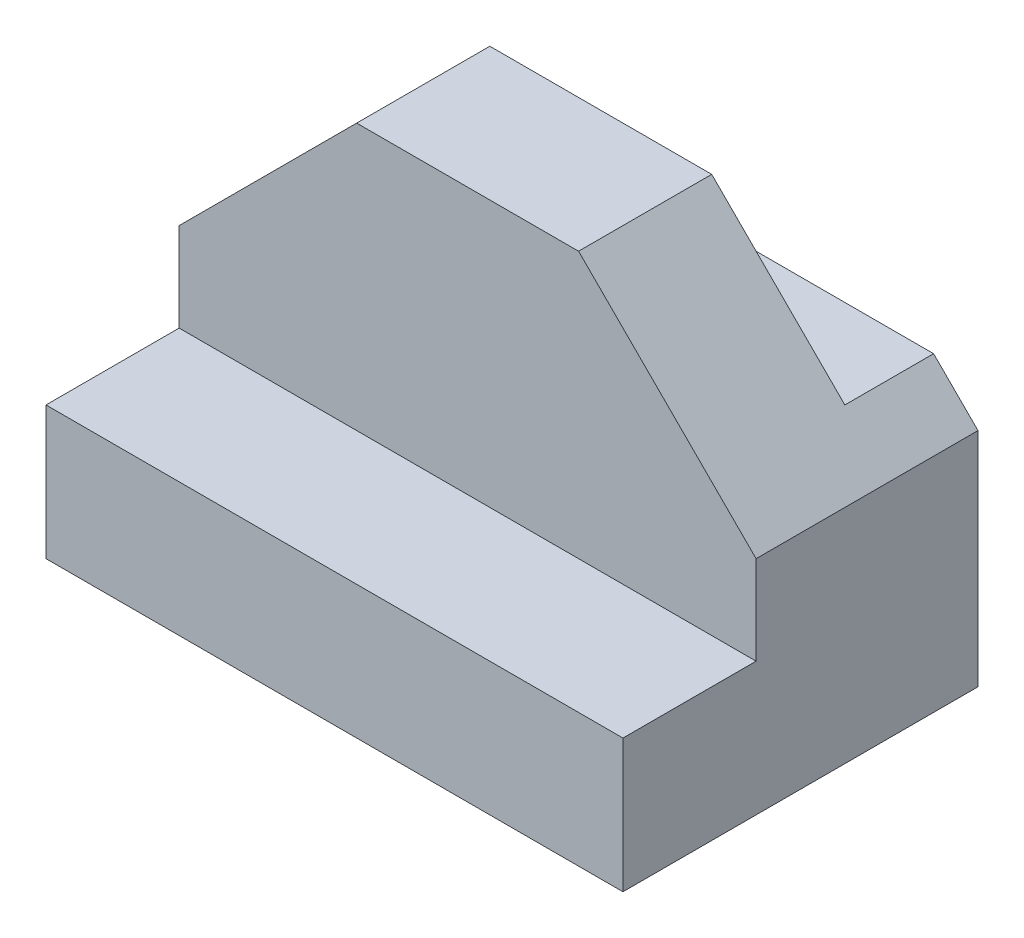
ISO-10303-21;
HEADER;
FILE_DESCRIPTION(('STEP AP214'),'2;1');
FILE_NAME('part.step','',(''),(''),'','','');
FILE_SCHEMA(('AUTOMOTIVE_DESIGN { 1 0 10303 214 1 1 1 1 }'));
ENDSEC;
DATA;
#1=APPLICATION_CONTEXT('core data for automotive mechanical design processes');
#2=APPLICATION_PROTOCOL_DEFINITION('international standard','automotive_design',2000,#1);
#3=PRODUCT_CONTEXT('',#1,'mechanical');
#4=PRODUCT('Part','Part','',(#3));
#5=PRODUCT_RELATED_PRODUCT_CATEGORY('part','',(#4));
#6=PRODUCT_DEFINITION_FORMATION('','',#4);
#7=PRODUCT_DEFINITION_CONTEXT('part definition',#1,'design');
#8=PRODUCT_DEFINITION('design','',#6,#7);
#9=PRODUCT_DEFINITION_SHAPE('','',#8);
#10=(LENGTH_UNIT() NAMED_UNIT(*) SI_UNIT(.MILLI.,.METRE.));
#11=(NAMED_UNIT(*) PLANE_ANGLE_UNIT() SI_UNIT($,.RADIAN.));
#12=(NAMED_UNIT(*) SI_UNIT($,.STERADIAN.) SOLID_ANGLE_UNIT());
#13=UNCERTAINTY_MEASURE_WITH_UNIT(LENGTH_MEASURE(1.E-05),#10,'distance_accuracy_value','');
#14=(GEOMETRIC_REPRESENTATION_CONTEXT(3) GLOBAL_UNCERTAINTY_ASSIGNED_CONTEXT((#13)) GLOBAL_UNIT_ASSIGNED_CONTEXT((#10,
#11,#12)) REPRESENTATION_CONTEXT('',''));
#15=CARTESIAN_POINT('',(0.,0.,0.));
#16=DIRECTION('',(0.,0.,1.));
#17=DIRECTION('',(1.,0.,0.));
#18=AXIS2_PLACEMENT_3D('',#15,#16,#17);
#19=CARTESIAN_POINT('',(65.,2.36648320366556,20.6941876196283));
#20=DIRECTION('',(0.,0.,-1.));
#21=DIRECTION('',(0.,1.,0.));
#22=AXIS2_PLACEMENT_3D('',#19,#20,#21);
#23=PLANE('',#22);
#24=DIRECTION('',(0.,-1.,0.));
#25=VECTOR('',#24,1.);
#26=CARTESIAN_POINT('',(0.,2.36648320366556,20.6941876196283));
#27=LINE('',#26,#25);
#28=CARTESIAN_POINT('',(0.,2.36648320366556,20.6941876196283));
#29=VERTEX_POINT('',#28);
#30=CARTESIAN_POINT('',(0.,-12.6335167963344,20.6941876196283));
#31=VERTEX_POINT('',#30);
#32=EDGE_CURVE('E138',#29,#31,#27,.T.);
#33=ORIENTED_EDGE('',*,*,#32,.T.);
#34=DIRECTION('',(-1.,0.,0.));
#35=VECTOR('',#34,1.);
#36=CARTESIAN_POINT('',(65.,-12.6335167963344,20.6941876196283));
#37=LINE('',#36,#35);
#38=CARTESIAN_POINT('',(65.,-12.6335167963344,20.6941876196283));
#39=VERTEX_POINT('',#38);
#40=EDGE_CURVE('E118',#39,#31,#37,.T.);
#41=ORIENTED_EDGE('',*,*,#40,.F.);
#42=DIRECTION('',(0.,-1.,0.));
#43=VECTOR('',#42,1.);
#44=CARTESIAN_POINT('',(65.,2.36648320366556,20.6941876196283));
#45=LINE('',#44,#43);
#46=CARTESIAN_POINT('',(65.,2.36648320366556,20.6941876196283));
#47=VERTEX_POINT('',#46);
#48=EDGE_CURVE('E126',#47,#39,#45,.T.);
#49=ORIENTED_EDGE('',*,*,#48,.F.);
#50=DIRECTION('',(-1.,0.,0.));
#51=VECTOR('',#50,1.);
#52=CARTESIAN_POINT('',(65.,2.36648320366556,20.6941876196283));
#53=LINE('',#52,#51);
#54=EDGE_CURVE('E209',#47,#29,#53,.T.);
#55=ORIENTED_EDGE('',*,*,#54,.T.);
#56=EDGE_LOOP('',(#33,#41,#49,#55));
#57=FACE_BOUND('',#56,.T.);
#58=ADVANCED_FACE('F35',(#57),#23,.F.);
#59=CARTESIAN_POINT('',(65.,-12.6335167963344,20.6941876196283));
#60=DIRECTION('',(0.,1.,0.));
#61=DIRECTION('',(0.,0.,1.));
#62=AXIS2_PLACEMENT_3D('',#59,#60,#61);
#63=PLANE('',#62);
#64=DIRECTION('',(0.,0.,-1.));
#65=VECTOR('',#64,1.);
#66=CARTESIAN_POINT('',(0.,-12.6335167963344,20.6941876196283));
#67=LINE('',#66,#65);
#68=CARTESIAN_POINT('',(0.,-12.6335167963344,-19.3058123803717));
#69=VERTEX_POINT('',#68);
#70=EDGE_CURVE('E174',#31,#69,#67,.T.);
#71=ORIENTED_EDGE('',*,*,#70,.T.);
#72=DIRECTION('',(-1.,0.,0.));
#73=VECTOR('',#72,1.);
#74=CARTESIAN_POINT('',(65.,-12.6335167963344,-19.3058123803717));
#75=LINE('',#74,#73);
#76=CARTESIAN_POINT('',(65.,-12.6335167963344,-19.3058123803717));
#77=VERTEX_POINT('',#76);
#78=EDGE_CURVE('E121',#77,#69,#75,.T.);
#79=ORIENTED_EDGE('',*,*,#78,.F.);
#80=DIRECTION('',(0.,0.,-1.));
#81=VECTOR('',#80,1.);
#82=CARTESIAN_POINT('',(65.,-12.6335167963344,20.6941876196283));
#83=LINE('',#82,#81);
#84=EDGE_CURVE('E114',#39,#77,#83,.T.);
#85=ORIENTED_EDGE('',*,*,#84,.F.);
#86=ORIENTED_EDGE('',*,*,#40,.T.);
#87=EDGE_LOOP('',(#71,#79,#85,#86));
#88=FACE_BOUND('',#87,.T.);
#89=ADVANCED_FACE('F116',(#88),#63,.F.);
#90=CARTESIAN_POINT('',(65.,-12.6335167963344,-19.3058123803717));
#91=DIRECTION('',(0.,0.,1.));
#92=DIRECTION('',(0.,-1.,0.));
#93=AXIS2_PLACEMENT_3D('',#90,#91,#92);
#94=PLANE('',#93);
#95=DIRECTION('',(0.,1.,0.));
#96=VECTOR('',#95,1.);
#97=CARTESIAN_POINT('',(0.,-12.6335167963344,-19.3058123803717));
#98=LINE('',#97,#96);
#99=CARTESIAN_POINT('',(0.,12.3664832036655,-19.3058123803717));
#100=VERTEX_POINT('',#99);
#101=EDGE_CURVE('E169',#69,#100,#98,.T.);
#102=ORIENTED_EDGE('',*,*,#101,.T.);
#103=DIRECTION('',(-0.707106781186546,-0.707106781186549,0.));
#104=VECTOR('',#103,1.);
#105=CARTESIAN_POINT('',(20.,32.3664832036656,-19.3058123803717));
#106=LINE('',#105,#104);
#107=CARTESIAN_POINT('',(5.00000000000005,17.3664832036656,-19.3058123803717));
#108=VERTEX_POINT('',#107);
#109=EDGE_CURVE('E58',#100,#108,#106,.F.);
#110=ORIENTED_EDGE('',*,*,#109,.T.);
#111=DIRECTION('',(-1.,0.,0.));
#112=VECTOR('',#111,1.);
#113=CARTESIAN_POINT('',(65.,17.3664832036656,-19.3058123803717));
#114=LINE('',#113,#112);
#115=CARTESIAN_POINT('',(60.,17.3664832036656,-19.3058123803717));
#116=VERTEX_POINT('',#115);
#117=EDGE_CURVE('E144',#116,#108,#114,.T.);
#118=ORIENTED_EDGE('',*,*,#117,.F.);
#119=DIRECTION('',(0.707106781186549,-0.707106781186546,0.));
#120=VECTOR('',#119,1.);
#121=CARTESIAN_POINT('',(65.,12.3664832036656,-19.3058123803717));
#122=LINE('',#121,#120);
#123=CARTESIAN_POINT('',(65.,12.3664832036656,-19.3058123803717));
#124=VERTEX_POINT('',#123);
#125=EDGE_CURVE('E155',#116,#124,#122,.T.);
#126=ORIENTED_EDGE('',*,*,#125,.T.);
#127=DIRECTION('',(0.,1.,0.));
#128=VECTOR('',#127,1.);
#129=CARTESIAN_POINT('',(65.,-12.6335167963344,-19.3058123803717));
#130=LINE('',#129,#128);
#131=EDGE_CURVE('E125',#77,#124,#130,.T.);
#132=ORIENTED_EDGE('',*,*,#131,.F.);
#133=ORIENTED_EDGE('',*,*,#78,.T.);
#134=EDGE_LOOP('',(#102,#110,#118,#126,#132,#133));
#135=FACE_BOUND('',#134,.T.);
#136=ADVANCED_FACE('F173',(#135),#94,.F.);
#137=CARTESIAN_POINT('',(65.,17.3664832036656,-19.3058123803717));
#138=DIRECTION('',(0.,-1.,0.));
#139=DIRECTION('',(0.,0.,-1.));
#140=AXIS2_PLACEMENT_3D('',#137,#138,#139);
#141=PLANE('',#140);
#142=ORIENTED_EDGE('',*,*,#117,.T.);
#143=DIRECTION('',(0.,0.,-1.));
#144=VECTOR('',#143,1.);
#145=CARTESIAN_POINT('',(5.00000000000005,17.3664832036656,-9.30581238037173));
#146=LINE('',#145,#144);
#147=CARTESIAN_POINT('',(5.00000000000005,17.3664832036656,-9.30581238037173));
#148=VERTEX_POINT('',#147);
#149=EDGE_CURVE('E44',#108,#148,#146,.F.);
#150=ORIENTED_EDGE('',*,*,#149,.T.);
#151=DIRECTION('',(-1.,0.,0.));
#152=VECTOR('',#151,1.);
#153=CARTESIAN_POINT('',(65.,17.3664832036656,-9.30581238037173));
#154=LINE('',#153,#152);
#155=CARTESIAN_POINT('',(60.,17.3664832036656,-9.30581238037173));
#156=VERTEX_POINT('',#155);
#157=EDGE_CURVE('E184',#156,#148,#154,.T.);
#158=ORIENTED_EDGE('',*,*,#157,.F.);
#159=DIRECTION('',(0.,0.,-1.));
#160=VECTOR('',#159,1.);
#161=CARTESIAN_POINT('',(60.,17.3664832036656,0.));
#162=LINE('',#161,#160);
#163=EDGE_CURVE('E153',#156,#116,#162,.T.);
#164=ORIENTED_EDGE('',*,*,#163,.T.);
#165=EDGE_LOOP('',(#142,#150,#158,#164));
#166=FACE_BOUND('',#165,.T.);
#167=ADVANCED_FACE('F196',(#166),#141,.F.);
#168=CARTESIAN_POINT('',(65.,17.3664832036656,-9.30581238037173));
#169=DIRECTION('',(0.,0.,1.));
#170=DIRECTION('',(0.,-1.,0.));
#171=AXIS2_PLACEMENT_3D('',#168,#169,#170);
#172=PLANE('',#171);
#173=ORIENTED_EDGE('',*,*,#157,.T.);
#174=DIRECTION('',(-0.707106781186546,-0.707106781186549,0.));
#175=VECTOR('',#174,1.);
#176=CARTESIAN_POINT('',(20.,32.3664832036656,-9.30581238037172));
#177=LINE('',#176,#175);
#178=CARTESIAN_POINT('',(20.,32.3664832036656,-9.30581238037172));
#179=VERTEX_POINT('',#178);
#180=EDGE_CURVE('E11',#148,#179,#177,.F.);
#181=ORIENTED_EDGE('',*,*,#180,.T.);
#182=DIRECTION('',(-1.,0.,0.));
#183=VECTOR('',#182,1.);
#184=CARTESIAN_POINT('',(65.,32.3664832036656,-9.30581238037172));
#185=LINE('',#184,#183);
#186=CARTESIAN_POINT('',(44.9999999999999,32.3664832036656,-9.30581238037172));
#187=VERTEX_POINT('',#186);
#188=EDGE_CURVE('E182',#187,#179,#185,.T.);
#189=ORIENTED_EDGE('',*,*,#188,.F.);
#190=DIRECTION('',(0.707106781186549,-0.707106781186546,0.));
#191=VECTOR('',#190,1.);
#192=CARTESIAN_POINT('',(65.,12.3664832036656,-9.30581238037173));
#193=LINE('',#192,#191);
#194=EDGE_CURVE('E151',#187,#156,#193,.T.);
#195=ORIENTED_EDGE('',*,*,#194,.T.);
#196=EDGE_LOOP('',(#173,#181,#189,#195));
#197=FACE_BOUND('',#196,.T.);
#198=ADVANCED_FACE('F181',(#197),#172,.F.);
#199=CARTESIAN_POINT('',(65.,32.3664832036656,-9.30581238037172));
#200=DIRECTION('',(0.,-1.,0.));
#201=DIRECTION('',(0.,0.,-1.));
#202=AXIS2_PLACEMENT_3D('',#199,#200,#201);
#203=PLANE('',#202);
#204=ORIENTED_EDGE('',*,*,#188,.T.);
#205=DIRECTION('',(0.,0.,1.));
#206=VECTOR('',#205,1.);
#207=CARTESIAN_POINT('',(20.,32.3664832036656,-9.30581238037172));
#208=LINE('',#207,#206);
#209=CARTESIAN_POINT('',(20.,32.3664832036656,5.69418761962827));
#210=VERTEX_POINT('',#209);
#211=EDGE_CURVE('E157',#179,#210,#208,.T.);
#212=ORIENTED_EDGE('',*,*,#211,.T.);
#213=DIRECTION('',(-1.,0.,0.));
#214=VECTOR('',#213,1.);
#215=CARTESIAN_POINT('',(65.,32.3664832036656,5.69418761962827));
#216=LINE('',#215,#214);
#217=CARTESIAN_POINT('',(44.9999999999999,32.3664832036656,5.69418761962827));
#218=VERTEX_POINT('',#217);
#219=EDGE_CURVE('E190',#218,#210,#216,.T.);
#220=ORIENTED_EDGE('',*,*,#219,.F.);
#221=DIRECTION('',(0.,0.,-1.));
#222=VECTOR('',#221,1.);
#223=CARTESIAN_POINT('',(44.9999999999999,32.3664832036656,-9.30581238037172));
#224=LINE('',#223,#222);
#225=EDGE_CURVE('E149',#218,#187,#224,.T.);
#226=ORIENTED_EDGE('',*,*,#225,.T.);
#227=EDGE_LOOP('',(#204,#212,#220,#226));
#228=FACE_BOUND('',#227,.T.);
#229=ADVANCED_FACE('F186',(#228),#203,.F.);
#230=CARTESIAN_POINT('',(65.,32.3664832036656,5.69418761962827));
#231=DIRECTION('',(0.,0.,-1.));
#232=DIRECTION('',(0.,1.,0.));
#233=AXIS2_PLACEMENT_3D('',#230,#231,#232);
#234=PLANE('',#233);
#235=ORIENTED_EDGE('',*,*,#219,.T.);
#236=DIRECTION('',(0.707106781186546,0.707106781186549,0.));
#237=VECTOR('',#236,1.);
#238=CARTESIAN_POINT('',(20.,32.3664832036656,5.69418761962827));
#239=LINE('',#238,#237);
#240=CARTESIAN_POINT('',(0.,12.3664832036655,5.69418761962827));
#241=VERTEX_POINT('',#240);
#242=EDGE_CURVE('E160',#210,#241,#239,.F.);
#243=ORIENTED_EDGE('',*,*,#242,.T.);
#244=DIRECTION('',(0.,-1.,0.));
#245=VECTOR('',#244,1.);
#246=CARTESIAN_POINT('',(0.,32.3664832036656,5.69418761962827));
#247=LINE('',#246,#245);
#248=CARTESIAN_POINT('',(0.,2.36648320366556,5.69418761962826));
#249=VERTEX_POINT('',#248);
#250=EDGE_CURVE('E171',#241,#249,#247,.T.);
#251=ORIENTED_EDGE('',*,*,#250,.T.);
#252=DIRECTION('',(-1.,0.,0.));
#253=VECTOR('',#252,1.);
#254=CARTESIAN_POINT('',(65.,2.36648320366556,5.69418761962826));
#255=LINE('',#254,#253);
#256=CARTESIAN_POINT('',(65.,2.36648320366556,5.69418761962826));
#257=VERTEX_POINT('',#256);
#258=EDGE_CURVE('E193',#257,#249,#255,.T.);
#259=ORIENTED_EDGE('',*,*,#258,.F.);
#260=DIRECTION('',(0.,-1.,0.));
#261=VECTOR('',#260,1.);
#262=CARTESIAN_POINT('',(65.,32.3664832036656,5.69418761962827));
#263=LINE('',#262,#261);
#264=CARTESIAN_POINT('',(65.,12.3664832036656,5.69418761962827));
#265=VERTEX_POINT('',#264);
#266=EDGE_CURVE('E203',#265,#257,#263,.T.);
#267=ORIENTED_EDGE('',*,*,#266,.F.);
#268=DIRECTION('',(-0.707106781186549,0.707106781186546,0.));
#269=VECTOR('',#268,1.);
#270=CARTESIAN_POINT('',(65.,12.3664832036656,5.69418761962827));
#271=LINE('',#270,#269);
#272=EDGE_CURVE('E142',#265,#218,#271,.T.);
#273=ORIENTED_EDGE('',*,*,#272,.T.);
#274=EDGE_LOOP('',(#235,#243,#251,#259,#267,#273));
#275=FACE_BOUND('',#274,.T.);
#276=ADVANCED_FACE('F206',(#275),#234,.F.);
#277=CARTESIAN_POINT('',(65.,2.36648320366556,5.69418761962826));
#278=DIRECTION('',(0.,-1.,0.));
#279=DIRECTION('',(0.,0.,-1.));
#280=AXIS2_PLACEMENT_3D('',#277,#278,#279);
#281=PLANE('',#280);
#282=DIRECTION('',(0.,0.,1.));
#283=VECTOR('',#282,1.);
#284=CARTESIAN_POINT('',(0.,2.36648320366556,5.69418761962826));
#285=LINE('',#284,#283);
#286=EDGE_CURVE('E135',#249,#29,#285,.T.);
#287=ORIENTED_EDGE('',*,*,#286,.T.);
#288=ORIENTED_EDGE('',*,*,#54,.F.);
#289=DIRECTION('',(0.,0.,1.));
#290=VECTOR('',#289,1.);
#291=CARTESIAN_POINT('',(65.,2.36648320366556,5.69418761962826));
#292=LINE('',#291,#290);
#293=EDGE_CURVE('E131',#257,#47,#292,.T.);
#294=ORIENTED_EDGE('',*,*,#293,.F.);
#295=ORIENTED_EDGE('',*,*,#258,.T.);
#296=EDGE_LOOP('',(#287,#288,#294,#295));
#297=FACE_BOUND('',#296,.T.);
#298=ADVANCED_FACE('F218',(#297),#281,.F.);
#299=CARTESIAN_POINT('',(65.,0.,0.));
#300=DIRECTION('',(1.,0.,0.));
#301=DIRECTION('',(0.,0.,-1.));
#302=AXIS2_PLACEMENT_3D('',#299,#300,#301);
#303=PLANE('',#302);
#304=ORIENTED_EDGE('',*,*,#131,.T.);
#305=DIRECTION('',(0.,0.,1.));
#306=VECTOR('',#305,1.);
#307=CARTESIAN_POINT('',(65.,12.3664832036656,5.69418761962827));
#308=LINE('',#307,#306);
#309=EDGE_CURVE('E139',#124,#265,#308,.T.);
#310=ORIENTED_EDGE('',*,*,#309,.T.);
#311=ORIENTED_EDGE('',*,*,#266,.T.);
#312=ORIENTED_EDGE('',*,*,#293,.T.);
#313=ORIENTED_EDGE('',*,*,#48,.T.);
#314=ORIENTED_EDGE('',*,*,#84,.T.);
#315=EDGE_LOOP('',(#304,#310,#311,#312,#313,#314));
#316=FACE_BOUND('',#315,.T.);
#317=ADVANCED_FACE('F129',(#316),#303,.T.);
#318=CARTESIAN_POINT('',(0.,0.,0.));
#319=DIRECTION('',(1.,0.,0.));
#320=DIRECTION('',(0.,0.,-1.));
#321=AXIS2_PLACEMENT_3D('',#318,#319,#320);
#322=PLANE('',#321);
#323=ORIENTED_EDGE('',*,*,#250,.F.);
#324=DIRECTION('',(0.,0.,-1.));
#325=VECTOR('',#324,1.);
#326=CARTESIAN_POINT('',(0.,12.3664832036655,0.));
#327=LINE('',#326,#325);
#328=EDGE_CURVE('E162',#241,#100,#327,.T.);
#329=ORIENTED_EDGE('',*,*,#328,.T.);
#330=ORIENTED_EDGE('',*,*,#101,.F.);
#331=ORIENTED_EDGE('',*,*,#70,.F.);
#332=ORIENTED_EDGE('',*,*,#32,.F.);
#333=ORIENTED_EDGE('',*,*,#286,.F.);
#334=EDGE_LOOP('',(#323,#329,#330,#331,#332,#333));
#335=FACE_BOUND('',#334,.T.);
#336=ADVANCED_FACE('F168',(#335),#322,.F.);
#337=CARTESIAN_POINT('',(65.,12.3664832036656,0.));
#338=DIRECTION('',(0.707106781186546,0.707106781186549,0.));
#339=DIRECTION('',(0.,0.,-1.));
#340=AXIS2_PLACEMENT_3D('',#337,#338,#339);
#341=PLANE('',#340);
#342=ORIENTED_EDGE('',*,*,#194,.F.);
#343=ORIENTED_EDGE('',*,*,#225,.F.);
#344=ORIENTED_EDGE('',*,*,#272,.F.);
#345=ORIENTED_EDGE('',*,*,#309,.F.);
#346=ORIENTED_EDGE('',*,*,#125,.F.);
#347=ORIENTED_EDGE('',*,*,#163,.F.);
#348=EDGE_LOOP('',(#342,#343,#344,#345,#346,#347));
#349=FACE_BOUND('',#348,.T.);
#350=ADVANCED_FACE('F201',(#349),#341,.T.);
#351=CARTESIAN_POINT('',(20.,32.3664832036656,-9.30581238037172));
#352=DIRECTION('',(0.707106781186549,-0.707106781186546,0.));
#353=DIRECTION('',(0.,0.,1.));
#354=AXIS2_PLACEMENT_3D('',#351,#352,#353);
#355=PLANE('',#354);
#356=ORIENTED_EDGE('',*,*,#109,.F.);
#357=ORIENTED_EDGE('',*,*,#328,.F.);
#358=ORIENTED_EDGE('',*,*,#242,.F.);
#359=ORIENTED_EDGE('',*,*,#211,.F.);
#360=ORIENTED_EDGE('',*,*,#180,.F.);
#361=ORIENTED_EDGE('',*,*,#149,.F.);
#362=EDGE_LOOP('',(#356,#357,#358,#359,#360,#361));
#363=FACE_BOUND('',#362,.T.);
#364=ADVANCED_FACE('F38',(#363),#355,.F.);
#365=CLOSED_SHELL('',(#58,#89,#136,#167,#198,#229,#276,#298,#317,#336,#350,#364));
#366=MANIFOLD_SOLID_BREP('B2',#365);
#367=ADVANCED_BREP_SHAPE_REPRESENTATION('',(#18,#366),#14);
#368=SHAPE_DEFINITION_REPRESENTATION(#9,#367);
ENDSEC;
END-ISO-10303-21;
